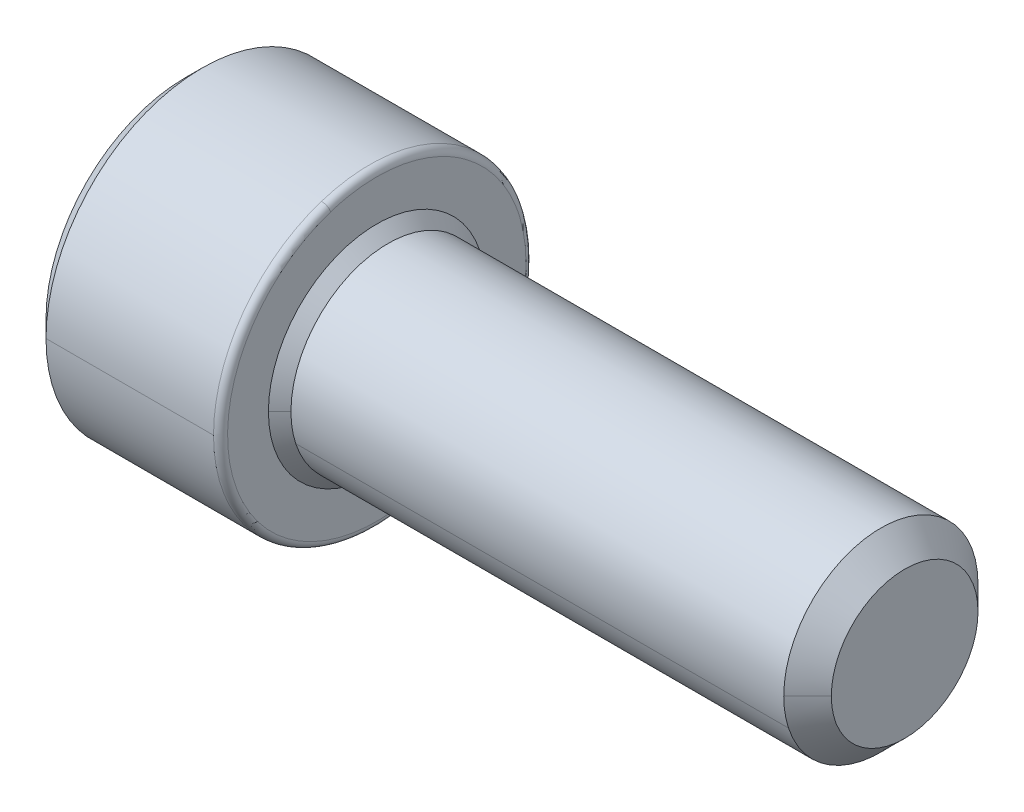
ISO-10303-21;
HEADER;
FILE_DESCRIPTION(('STEP AP214'),'2;1');
FILE_NAME('part.step','',(''),(''),'','','');
FILE_SCHEMA(('AUTOMOTIVE_DESIGN { 1 0 10303 214 1 1 1 1 }'));
ENDSEC;
DATA;
#1=APPLICATION_CONTEXT('core data for automotive mechanical design processes');
#2=APPLICATION_PROTOCOL_DEFINITION('international standard','automotive_design',2000,#1);
#3=PRODUCT_CONTEXT('',#1,'mechanical');
#4=PRODUCT('Part','Part','',(#3));
#5=PRODUCT_RELATED_PRODUCT_CATEGORY('part','',(#4));
#6=PRODUCT_DEFINITION_FORMATION('','',#4);
#7=PRODUCT_DEFINITION_CONTEXT('part definition',#1,'design');
#8=PRODUCT_DEFINITION('design','',#6,#7);
#9=PRODUCT_DEFINITION_SHAPE('','',#8);
#10=(LENGTH_UNIT() NAMED_UNIT(*) SI_UNIT(.MILLI.,.METRE.));
#11=(NAMED_UNIT(*) PLANE_ANGLE_UNIT() SI_UNIT($,.RADIAN.));
#12=(NAMED_UNIT(*) SI_UNIT($,.STERADIAN.) SOLID_ANGLE_UNIT());
#13=UNCERTAINTY_MEASURE_WITH_UNIT(LENGTH_MEASURE(1.E-05),#10,'distance_accuracy_value','');
#14=(GEOMETRIC_REPRESENTATION_CONTEXT(3) GLOBAL_UNCERTAINTY_ASSIGNED_CONTEXT((#13)) GLOBAL_UNIT_ASSIGNED_CONTEXT((#10,
#11,#12)) REPRESENTATION_CONTEXT('',''));
#15=CARTESIAN_POINT('',(0.,0.,0.));
#16=DIRECTION('',(0.,0.,1.));
#17=DIRECTION('',(1.,0.,0.));
#18=AXIS2_PLACEMENT_3D('',#15,#16,#17);
#19=CARTESIAN_POINT('',(-3.4544,1.400175,0.));
#20=DIRECTION('',(1.,0.,0.));
#21=DIRECTION('',(0.,0.,-1.));
#22=AXIS2_PLACEMENT_3D('',#19,#20,#21);
#23=PLANE('',#22);
#24=CARTESIAN_POINT('',(-3.4544,0.,0.));
#25=DIRECTION('',(1.,0.,0.));
#26=DIRECTION('',(0.,0.,-1.));
#27=AXIS2_PLACEMENT_3D('',#24,#25,#26);
#28=CIRCLE('',#27,2.5146);
#29=CARTESIAN_POINT('',(-3.4544,0.,2.5146));
#30=VERTEX_POINT('',#29);
#31=CARTESIAN_POINT('',(-3.4544,0.,-2.5146));
#32=VERTEX_POINT('',#31);
#33=EDGE_CURVE('E11',#30,#32,#28,.T.);
#34=ORIENTED_EDGE('',*,*,#33,.F.);
#35=CARTESIAN_POINT('',(-3.4544,0.,0.));
#36=DIRECTION('',(1.,0.,0.));
#37=DIRECTION('',(0.,0.,-1.));
#38=AXIS2_PLACEMENT_3D('',#35,#36,#37);
#39=CIRCLE('',#38,2.5146);
#40=EDGE_CURVE('E25',#32,#30,#39,.T.);
#41=ORIENTED_EDGE('',*,*,#40,.F.);
#42=EDGE_LOOP('',(#34,#41));
#43=FACE_BOUND('',#42,.T.);
#44=DIRECTION('',(0.,-0.500000000000017,0.866025403784429));
#45=VECTOR('',#44,1.);
#46=CARTESIAN_POINT('',(-3.4544,-0.86254336974385,-1.30638105987198));
#47=LINE('',#46,#45);
#48=CARTESIAN_POINT('',(-3.4544,-0.80839141316258,-1.400175));
#49=VERTEX_POINT('',#48);
#50=CARTESIAN_POINT('',(-3.4544,-1.6167828263252,0.));
#51=VERTEX_POINT('',#50);
#52=EDGE_CURVE('E535',#49,#51,#47,.T.);
#53=ORIENTED_EDGE('',*,*,#52,.F.);
#54=DIRECTION('',(0.,-1.,0.));
#55=VECTOR('',#54,1.);
#56=CARTESIAN_POINT('',(-3.4544,1.400175,-1.400175));
#57=LINE('',#56,#55);
#58=CARTESIAN_POINT('',(-3.4544,0.80839141316258,-1.400175));
#59=VERTEX_POINT('',#58);
#60=EDGE_CURVE('E530',#59,#49,#57,.T.);
#61=ORIENTED_EDGE('',*,*,#60,.F.);
#62=DIRECTION('',(0.,-0.500000000000017,-0.866025403784429));
#63=VECTOR('',#62,1.);
#64=CARTESIAN_POINT('',(-3.4544,1.56263086974389,-0.0937939401280775));
#65=LINE('',#64,#63);
#66=CARTESIAN_POINT('',(-3.4544,1.6167828263252,0.));
#67=VERTEX_POINT('',#66);
#68=EDGE_CURVE('E525',#67,#59,#65,.T.);
#69=ORIENTED_EDGE('',*,*,#68,.F.);
#70=DIRECTION('',(0.,0.500000000000017,-0.866025403784429));
#71=VECTOR('',#70,1.);
#72=CARTESIAN_POINT('',(-3.4544,1.56263086974389,0.0937939401280775));
#73=LINE('',#72,#71);
#74=CARTESIAN_POINT('',(-3.4544,0.80839141316258,1.400175));
#75=VERTEX_POINT('',#74);
#76=EDGE_CURVE('E520',#75,#67,#73,.T.);
#77=ORIENTED_EDGE('',*,*,#76,.F.);
#78=DIRECTION('',(0.,1.,0.));
#79=VECTOR('',#78,1.);
#80=CARTESIAN_POINT('',(-3.4544,1.400175,1.400175));
#81=LINE('',#80,#79);
#82=CARTESIAN_POINT('',(-3.4544,-0.80839141316258,1.400175));
#83=VERTEX_POINT('',#82);
#84=EDGE_CURVE('E515',#83,#75,#81,.T.);
#85=ORIENTED_EDGE('',*,*,#84,.F.);
#86=DIRECTION('',(0.,0.500000000000017,0.866025403784429));
#87=VECTOR('',#86,1.);
#88=CARTESIAN_POINT('',(-3.4544,-0.86254336974385,1.30638105987198));
#89=LINE('',#88,#87);
#90=EDGE_CURVE('E510',#51,#83,#89,.T.);
#91=ORIENTED_EDGE('',*,*,#90,.F.);
#92=EDGE_LOOP('',(#53,#61,#69,#77,#85,#91));
#93=FACE_BOUND('',#92,.T.);
#94=ADVANCED_FACE('F17',(#43,#93),#23,.F.);
#95=CARTESIAN_POINT('',(-1.8288,-0.80839141316258,1.400175));
#96=DIRECTION('',(0.,0.866025403784429,-0.500000000000017));
#97=DIRECTION('',(0.,0.500000000000017,0.866025403784429));
#98=AXIS2_PLACEMENT_3D('',#95,#96,#97);
#99=PLANE('',#98);
#100=DIRECTION('',(0.,-0.500000000000017,-0.866025403784429));
#101=VECTOR('',#100,1.);
#102=CARTESIAN_POINT('',(-1.8288,-0.80839141316258,1.400175));
#103=LINE('',#102,#101);
#104=CARTESIAN_POINT('',(-1.8288,-0.80839141316258,1.400175));
#105=VERTEX_POINT('',#104);
#106=CARTESIAN_POINT('',(-1.8288,-1.21258711974387,0.700087500000029));
#107=VERTEX_POINT('',#106);
#108=EDGE_CURVE('E506',#105,#107,#103,.T.);
#109=ORIENTED_EDGE('',*,*,#108,.T.);
#110=DIRECTION('',(0.,-0.500000000000017,-0.866025403784429));
#111=VECTOR('',#110,1.);
#112=CARTESIAN_POINT('',(-1.8288,-0.80839141316258,1.400175));
#113=LINE('',#112,#111);
#114=CARTESIAN_POINT('',(-1.8288,-1.6167828263252,0.));
#115=VERTEX_POINT('',#114);
#116=EDGE_CURVE('E502',#107,#115,#113,.T.);
#117=ORIENTED_EDGE('',*,*,#116,.T.);
#118=DIRECTION('',(-1.,0.,0.));
#119=VECTOR('',#118,1.);
#120=CARTESIAN_POINT('',(-1.8288,-1.6167828263252,0.));
#121=LINE('',#120,#119);
#122=EDGE_CURVE('E497',#115,#51,#121,.T.);
#123=ORIENTED_EDGE('',*,*,#122,.T.);
#124=ORIENTED_EDGE('',*,*,#90,.T.);
#125=DIRECTION('',(-1.,0.,0.));
#126=VECTOR('',#125,1.);
#127=CARTESIAN_POINT('',(-1.8288,-0.80839141316258,1.400175));
#128=LINE('',#127,#126);
#129=EDGE_CURVE('E492',#105,#83,#128,.T.);
#130=ORIENTED_EDGE('',*,*,#129,.F.);
#131=EDGE_LOOP('',(#109,#117,#123,#124,#130));
#132=FACE_BOUND('',#131,.T.);
#133=ADVANCED_FACE('F587',(#132),#99,.T.);
#134=CARTESIAN_POINT('',(-1.8288,0.80839141316258,1.400175));
#135=DIRECTION('',(0.,0.,-1.));
#136=DIRECTION('',(-1.,0.,0.));
#137=AXIS2_PLACEMENT_3D('',#134,#135,#136);
#138=PLANE('',#137);
#139=DIRECTION('',(0.,-1.,0.));
#140=VECTOR('',#139,1.);
#141=CARTESIAN_POINT('',(-1.8288,0.80839141316258,1.400175));
#142=LINE('',#141,#140);
#143=CARTESIAN_POINT('',(-1.8288,0.80839141316258,1.400175));
#144=VERTEX_POINT('',#143);
#145=CARTESIAN_POINT('',(-1.8288,0.,1.400175));
#146=VERTEX_POINT('',#145);
#147=EDGE_CURVE('E488',#144,#146,#142,.T.);
#148=ORIENTED_EDGE('',*,*,#147,.T.);
#149=DIRECTION('',(0.,-1.,0.));
#150=VECTOR('',#149,1.);
#151=CARTESIAN_POINT('',(-1.8288,0.80839141316258,1.400175));
#152=LINE('',#151,#150);
#153=EDGE_CURVE('E483',#146,#105,#152,.T.);
#154=ORIENTED_EDGE('',*,*,#153,.T.);
#155=ORIENTED_EDGE('',*,*,#129,.T.);
#156=ORIENTED_EDGE('',*,*,#84,.T.);
#157=DIRECTION('',(-1.,0.,0.));
#158=VECTOR('',#157,1.);
#159=CARTESIAN_POINT('',(-1.8288,0.80839141316258,1.400175));
#160=LINE('',#159,#158);
#161=EDGE_CURVE('E478',#144,#75,#160,.T.);
#162=ORIENTED_EDGE('',*,*,#161,.F.);
#163=EDGE_LOOP('',(#148,#154,#155,#156,#162));
#164=FACE_BOUND('',#163,.T.);
#165=ADVANCED_FACE('F591',(#164),#138,.T.);
#166=CARTESIAN_POINT('',(-1.8288,1.6167828263252,0.));
#167=DIRECTION('',(0.,-0.866025403784429,-0.500000000000017));
#168=DIRECTION('',(0.,0.500000000000017,-0.866025403784429));
#169=AXIS2_PLACEMENT_3D('',#166,#167,#168);
#170=PLANE('',#169);
#171=DIRECTION('',(0.,-0.500000000000017,0.866025403784429));
#172=VECTOR('',#171,1.);
#173=CARTESIAN_POINT('',(-1.8288,1.6167828263252,0.));
#174=LINE('',#173,#172);
#175=CARTESIAN_POINT('',(-1.8288,1.6167828263252,0.));
#176=VERTEX_POINT('',#175);
#177=CARTESIAN_POINT('',(-1.8288,1.21258711974387,0.700087500000029));
#178=VERTEX_POINT('',#177);
#179=EDGE_CURVE('E474',#176,#178,#174,.T.);
#180=ORIENTED_EDGE('',*,*,#179,.T.);
#181=DIRECTION('',(0.,-0.500000000000017,0.866025403784429));
#182=VECTOR('',#181,1.);
#183=CARTESIAN_POINT('',(-1.8288,1.6167828263252,0.));
#184=LINE('',#183,#182);
#185=EDGE_CURVE('E469',#178,#144,#184,.T.);
#186=ORIENTED_EDGE('',*,*,#185,.T.);
#187=ORIENTED_EDGE('',*,*,#161,.T.);
#188=ORIENTED_EDGE('',*,*,#76,.T.);
#189=DIRECTION('',(-1.,0.,0.));
#190=VECTOR('',#189,1.);
#191=CARTESIAN_POINT('',(-1.8288,1.6167828263252,0.));
#192=LINE('',#191,#190);
#193=EDGE_CURVE('E464',#176,#67,#192,.T.);
#194=ORIENTED_EDGE('',*,*,#193,.F.);
#195=EDGE_LOOP('',(#180,#186,#187,#188,#194));
#196=FACE_BOUND('',#195,.T.);
#197=ADVANCED_FACE('F606',(#196),#170,.T.);
#198=CARTESIAN_POINT('',(-1.8288,0.80839141316258,-1.400175));
#199=DIRECTION('',(0.,-0.866025403784429,0.500000000000017));
#200=DIRECTION('',(0.,-0.500000000000017,-0.866025403784429));
#201=AXIS2_PLACEMENT_3D('',#198,#199,#200);
#202=PLANE('',#201);
#203=DIRECTION('',(0.,0.500000000000017,0.866025403784429));
#204=VECTOR('',#203,1.);
#205=CARTESIAN_POINT('',(-1.8288,0.80839141316258,-1.400175));
#206=LINE('',#205,#204);
#207=CARTESIAN_POINT('',(-1.8288,0.80839141316258,-1.400175));
#208=VERTEX_POINT('',#207);
#209=CARTESIAN_POINT('',(-1.8288,1.21258711974387,-0.700087500000029));
#210=VERTEX_POINT('',#209);
#211=EDGE_CURVE('E460',#208,#210,#206,.T.);
#212=ORIENTED_EDGE('',*,*,#211,.T.);
#213=DIRECTION('',(0.,0.500000000000017,0.866025403784429));
#214=VECTOR('',#213,1.);
#215=CARTESIAN_POINT('',(-1.8288,0.80839141316258,-1.400175));
#216=LINE('',#215,#214);
#217=EDGE_CURVE('E455',#210,#176,#216,.T.);
#218=ORIENTED_EDGE('',*,*,#217,.T.);
#219=ORIENTED_EDGE('',*,*,#193,.T.);
#220=ORIENTED_EDGE('',*,*,#68,.T.);
#221=DIRECTION('',(-1.,0.,0.));
#222=VECTOR('',#221,1.);
#223=CARTESIAN_POINT('',(-1.8288,0.80839141316258,-1.400175));
#224=LINE('',#223,#222);
#225=EDGE_CURVE('E450',#208,#59,#224,.T.);
#226=ORIENTED_EDGE('',*,*,#225,.F.);
#227=EDGE_LOOP('',(#212,#218,#219,#220,#226));
#228=FACE_BOUND('',#227,.T.);
#229=ADVANCED_FACE('F604',(#228),#202,.T.);
#230=CARTESIAN_POINT('',(-1.8288,-0.80839141316258,-1.400175));
#231=DIRECTION('',(0.,0.,1.));
#232=DIRECTION('',(1.,0.,0.));
#233=AXIS2_PLACEMENT_3D('',#230,#231,#232);
#234=PLANE('',#233);
#235=DIRECTION('',(0.,1.,0.));
#236=VECTOR('',#235,1.);
#237=CARTESIAN_POINT('',(-1.8288,-0.80839141316258,-1.400175));
#238=LINE('',#237,#236);
#239=CARTESIAN_POINT('',(-1.8288,-0.80839141316258,-1.400175));
#240=VERTEX_POINT('',#239);
#241=CARTESIAN_POINT('',(-1.8288,0.,-1.400175));
#242=VERTEX_POINT('',#241);
#243=EDGE_CURVE('E446',#240,#242,#238,.T.);
#244=ORIENTED_EDGE('',*,*,#243,.T.);
#245=DIRECTION('',(0.,1.,0.));
#246=VECTOR('',#245,1.);
#247=CARTESIAN_POINT('',(-1.8288,-0.80839141316258,-1.400175));
#248=LINE('',#247,#246);
#249=EDGE_CURVE('E441',#242,#208,#248,.T.);
#250=ORIENTED_EDGE('',*,*,#249,.T.);
#251=ORIENTED_EDGE('',*,*,#225,.T.);
#252=ORIENTED_EDGE('',*,*,#60,.T.);
#253=DIRECTION('',(-1.,0.,0.));
#254=VECTOR('',#253,1.);
#255=CARTESIAN_POINT('',(-1.8288,-0.80839141316258,-1.400175));
#256=LINE('',#255,#254);
#257=EDGE_CURVE('E436',#240,#49,#256,.T.);
#258=ORIENTED_EDGE('',*,*,#257,.F.);
#259=EDGE_LOOP('',(#244,#250,#251,#252,#258));
#260=FACE_BOUND('',#259,.T.);
#261=ADVANCED_FACE('F600',(#260),#234,.T.);
#262=CARTESIAN_POINT('',(-1.8288,-1.6167828263252,0.));
#263=DIRECTION('',(0.,0.866025403784429,0.500000000000017));
#264=DIRECTION('',(0.,-0.500000000000017,0.866025403784429));
#265=AXIS2_PLACEMENT_3D('',#262,#263,#264);
#266=PLANE('',#265);
#267=DIRECTION('',(0.,0.500000000000017,-0.866025403784429));
#268=VECTOR('',#267,1.);
#269=CARTESIAN_POINT('',(-1.8288,-1.6167828263252,0.));
#270=LINE('',#269,#268);
#271=CARTESIAN_POINT('',(-1.8288,-1.21258711974387,-0.700087500000029));
#272=VERTEX_POINT('',#271);
#273=EDGE_CURVE('E432',#115,#272,#270,.T.);
#274=ORIENTED_EDGE('',*,*,#273,.T.);
#275=DIRECTION('',(0.,0.500000000000017,-0.866025403784429));
#276=VECTOR('',#275,1.);
#277=CARTESIAN_POINT('',(-1.8288,-1.6167828263252,0.));
#278=LINE('',#277,#276);
#279=EDGE_CURVE('E427',#272,#240,#278,.T.);
#280=ORIENTED_EDGE('',*,*,#279,.T.);
#281=ORIENTED_EDGE('',*,*,#257,.T.);
#282=ORIENTED_EDGE('',*,*,#52,.T.);
#283=ORIENTED_EDGE('',*,*,#122,.F.);
#284=EDGE_LOOP('',(#274,#280,#281,#282,#283));
#285=FACE_BOUND('',#284,.T.);
#286=ADVANCED_FACE('F596',(#285),#266,.T.);
#287=CARTESIAN_POINT('',(-1.8288,0.,0.));
#288=DIRECTION('',(1.,0.,0.));
#289=DIRECTION('',(0.,0.,-1.));
#290=AXIS2_PLACEMENT_3D('',#287,#288,#289);
#291=PLANE('',#290);
#292=ORIENTED_EDGE('',*,*,#243,.F.);
#293=ORIENTED_EDGE('',*,*,#279,.F.);
#294=CARTESIAN_POINT('',(-1.8288,0.,0.));
#295=DIRECTION('',(1.,0.,0.));
#296=DIRECTION('',(0.,0.,-1.));
#297=AXIS2_PLACEMENT_3D('',#294,#295,#296);
#298=CIRCLE('',#297,1.400175);
#299=EDGE_CURVE('E422',#272,#242,#298,.T.);
#300=ORIENTED_EDGE('',*,*,#299,.T.);
#301=EDGE_LOOP('',(#292,#293,#300));
#302=FACE_BOUND('',#301,.T.);
#303=ADVANCED_FACE('F386',(#302),#291,.F.);
#304=CARTESIAN_POINT('',(-1.4246042934187,0.,0.));
#305=DIRECTION('',(-1.,0.,0.));
#306=DIRECTION('',(0.,1.,0.));
#307=AXIS2_PLACEMENT_3D('',#304,#305,#306);
#308=CONICAL_SURFACE('',#307,0.7000875,1.04719755119659);
#309=DIRECTION('',(-0.500000000000007,0.,-0.866025403784435));
#310=VECTOR('',#309,1.);
#311=CARTESIAN_POINT('',(-1.4246042934187,0.,-0.7000875));
#312=LINE('',#311,#310);
#313=CARTESIAN_POINT('',(-1.4246042934187,0.,-0.7000875));
#314=VERTEX_POINT('',#313);
#315=EDGE_CURVE('E417',#314,#242,#312,.T.);
#316=ORIENTED_EDGE('',*,*,#315,.T.);
#317=ORIENTED_EDGE('',*,*,#299,.F.);
#318=CARTESIAN_POINT('',(-1.8288,0.,0.));
#319=DIRECTION('',(1.,0.,0.));
#320=DIRECTION('',(0.,0.,-1.));
#321=AXIS2_PLACEMENT_3D('',#318,#319,#320);
#322=CIRCLE('',#321,1.400175);
#323=EDGE_CURVE('E412',#107,#272,#322,.T.);
#324=ORIENTED_EDGE('',*,*,#323,.F.);
#325=CARTESIAN_POINT('',(-1.8288,0.,0.));
#326=DIRECTION('',(1.,0.,0.));
#327=DIRECTION('',(0.,0.,-1.));
#328=AXIS2_PLACEMENT_3D('',#325,#326,#327);
#329=CIRCLE('',#328,1.400175);
#330=EDGE_CURVE('E407',#146,#107,#329,.T.);
#331=ORIENTED_EDGE('',*,*,#330,.F.);
#332=DIRECTION('',(-0.500000000000007,0.,0.866025403784435));
#333=VECTOR('',#332,1.);
#334=CARTESIAN_POINT('',(-1.4246042934187,0.,0.7000875));
#335=LINE('',#334,#333);
#336=CARTESIAN_POINT('',(-1.4246042934187,0.,0.7000875));
#337=VERTEX_POINT('',#336);
#338=EDGE_CURVE('E404',#337,#146,#335,.T.);
#339=ORIENTED_EDGE('',*,*,#338,.F.);
#340=CARTESIAN_POINT('',(-1.4246042934187,0.,0.));
#341=DIRECTION('',(1.,0.,0.));
#342=DIRECTION('',(0.,0.,1.));
#343=AXIS2_PLACEMENT_3D('',#340,#341,#342);
#344=CIRCLE('',#343,0.7000875);
#345=CARTESIAN_POINT('',(-1.42460429341869,-0.700087500000019,0.));
#346=VERTEX_POINT('',#345);
#347=EDGE_CURVE('E402',#337,#346,#344,.T.);
#348=ORIENTED_EDGE('',*,*,#347,.T.);
#349=CARTESIAN_POINT('',(-1.4246042934187,0.,0.));
#350=DIRECTION('',(1.,0.,0.));
#351=DIRECTION('',(0.,0.,-1.));
#352=AXIS2_PLACEMENT_3D('',#349,#350,#351);
#353=CIRCLE('',#352,0.7000875);
#354=EDGE_CURVE('E658',#346,#314,#353,.T.);
#355=ORIENTED_EDGE('',*,*,#354,.T.);
#356=EDGE_LOOP('',(#316,#317,#324,#331,#339,#348,#355));
#357=FACE_BOUND('',#356,.T.);
#358=ADVANCED_FACE('F381',(#357),#308,.F.);
#359=CARTESIAN_POINT('',(-2.63719141316281,0.,0.));
#360=DIRECTION('',(1.,0.,0.));
#361=DIRECTION('',(0.,0.,1.));
#362=AXIS2_PLACEMENT_3D('',#359,#360,#361);
#363=SPHERICAL_SURFACE('',#362,1.40017500000021);
#364=CARTESIAN_POINT('',(-2.63719141316281,0.,0.));
#365=DIRECTION('',(0.,0.,1.));
#366=DIRECTION('',(1.,0.,0.));
#367=AXIS2_PLACEMENT_3D('',#364,#365,#366);
#368=CIRCLE('',#367,1.40017500000021);
#369=CARTESIAN_POINT('',(-1.2370164131626,0.,0.));
#370=VERTEX_POINT('',#369);
#371=CARTESIAN_POINT('',(-1.42460429341869,0.700087499999988,0.));
#372=VERTEX_POINT('',#371);
#373=EDGE_CURVE('E659',#370,#372,#368,.T.);
#374=ORIENTED_EDGE('',*,*,#373,.T.);
#375=CARTESIAN_POINT('',(-1.4246042934187,0.,0.));
#376=DIRECTION('',(1.,0.,0.));
#377=DIRECTION('',(0.,0.,-1.));
#378=AXIS2_PLACEMENT_3D('',#375,#376,#377);
#379=CIRCLE('',#378,0.7000875);
#380=EDGE_CURVE('E655',#314,#372,#379,.T.);
#381=ORIENTED_EDGE('',*,*,#380,.F.);
#382=ORIENTED_EDGE('',*,*,#354,.F.);
#383=CARTESIAN_POINT('',(-2.63719141316281,0.,0.));
#384=DIRECTION('',(0.,0.,-1.));
#385=DIRECTION('',(1.,0.,0.));
#386=AXIS2_PLACEMENT_3D('',#383,#384,#385);
#387=CIRCLE('',#386,1.40017500000021);
#388=EDGE_CURVE('E356',#370,#346,#387,.T.);
#389=ORIENTED_EDGE('',*,*,#388,.F.);
#390=EDGE_LOOP('',(#374,#381,#382,#389));
#391=FACE_BOUND('',#390,.T.);
#392=ADVANCED_FACE('F376',(#391),#363,.F.);
#393=CARTESIAN_POINT('',(-2.63719141316281,0.,0.));
#394=DIRECTION('',(1.,0.,0.));
#395=DIRECTION('',(0.,0.,-1.));
#396=AXIS2_PLACEMENT_3D('',#393,#394,#395);
#397=SPHERICAL_SURFACE('',#396,1.40017500000021);
#398=ORIENTED_EDGE('',*,*,#388,.T.);
#399=ORIENTED_EDGE('',*,*,#347,.F.);
#400=CARTESIAN_POINT('',(-1.4246042934187,0.,0.));
#401=DIRECTION('',(1.,0.,0.));
#402=DIRECTION('',(0.,0.,-1.));
#403=AXIS2_PLACEMENT_3D('',#400,#401,#402);
#404=CIRCLE('',#403,0.7000875);
#405=EDGE_CURVE('E351',#372,#337,#404,.T.);
#406=ORIENTED_EDGE('',*,*,#405,.F.);
#407=ORIENTED_EDGE('',*,*,#373,.F.);
#408=EDGE_LOOP('',(#398,#399,#406,#407));
#409=FACE_BOUND('',#408,.T.);
#410=ADVANCED_FACE('F365',(#409),#397,.F.);
#411=CARTESIAN_POINT('',(-1.4246042934187,0.,0.));
#412=DIRECTION('',(-1.,0.,0.));
#413=DIRECTION('',(0.,-1.,0.));
#414=AXIS2_PLACEMENT_3D('',#411,#412,#413);
#415=CONICAL_SURFACE('',#414,0.7000875,1.04719755119659);
#416=ORIENTED_EDGE('',*,*,#315,.F.);
#417=ORIENTED_EDGE('',*,*,#380,.T.);
#418=ORIENTED_EDGE('',*,*,#405,.T.);
#419=ORIENTED_EDGE('',*,*,#338,.T.);
#420=CARTESIAN_POINT('',(-1.8288,0.,0.));
#421=DIRECTION('',(1.,0.,0.));
#422=DIRECTION('',(0.,0.,-1.));
#423=AXIS2_PLACEMENT_3D('',#420,#421,#422);
#424=CIRCLE('',#423,1.400175);
#425=EDGE_CURVE('E346',#178,#146,#424,.T.);
#426=ORIENTED_EDGE('',*,*,#425,.F.);
#427=CARTESIAN_POINT('',(-1.8288,0.,0.));
#428=DIRECTION('',(1.,0.,0.));
#429=DIRECTION('',(0.,0.,-1.));
#430=AXIS2_PLACEMENT_3D('',#427,#428,#429);
#431=CIRCLE('',#430,1.400175);
#432=EDGE_CURVE('E341',#210,#178,#431,.T.);
#433=ORIENTED_EDGE('',*,*,#432,.F.);
#434=CARTESIAN_POINT('',(-1.8288,0.,0.));
#435=DIRECTION('',(1.,0.,0.));
#436=DIRECTION('',(0.,0.,-1.));
#437=AXIS2_PLACEMENT_3D('',#434,#435,#436);
#438=CIRCLE('',#437,1.400175);
#439=EDGE_CURVE('E336',#242,#210,#438,.T.);
#440=ORIENTED_EDGE('',*,*,#439,.F.);
#441=EDGE_LOOP('',(#416,#417,#418,#419,#426,#433,#440));
#442=FACE_BOUND('',#441,.T.);
#443=ADVANCED_FACE('F375',(#442),#415,.F.);
#444=CARTESIAN_POINT('',(-1.8288,0.,0.));
#445=DIRECTION('',(1.,0.,0.));
#446=DIRECTION('',(0.,0.,-1.));
#447=AXIS2_PLACEMENT_3D('',#444,#445,#446);
#448=PLANE('',#447);
#449=ORIENTED_EDGE('',*,*,#211,.F.);
#450=ORIENTED_EDGE('',*,*,#249,.F.);
#451=ORIENTED_EDGE('',*,*,#439,.T.);
#452=EDGE_LOOP('',(#449,#450,#451));
#453=FACE_BOUND('',#452,.T.);
#454=ADVANCED_FACE('F640',(#453),#448,.F.);
#455=CARTESIAN_POINT('',(-1.8288,0.,0.));
#456=DIRECTION('',(1.,0.,0.));
#457=DIRECTION('',(0.,0.,-1.));
#458=AXIS2_PLACEMENT_3D('',#455,#456,#457);
#459=PLANE('',#458);
#460=ORIENTED_EDGE('',*,*,#179,.F.);
#461=ORIENTED_EDGE('',*,*,#217,.F.);
#462=ORIENTED_EDGE('',*,*,#432,.T.);
#463=EDGE_LOOP('',(#460,#461,#462));
#464=FACE_BOUND('',#463,.T.);
#465=ADVANCED_FACE('F637',(#464),#459,.F.);
#466=CARTESIAN_POINT('',(-1.8288,0.,0.));
#467=DIRECTION('',(1.,0.,0.));
#468=DIRECTION('',(0.,0.,-1.));
#469=AXIS2_PLACEMENT_3D('',#466,#467,#468);
#470=PLANE('',#469);
#471=ORIENTED_EDGE('',*,*,#147,.F.);
#472=ORIENTED_EDGE('',*,*,#185,.F.);
#473=ORIENTED_EDGE('',*,*,#425,.T.);
#474=EDGE_LOOP('',(#471,#472,#473));
#475=FACE_BOUND('',#474,.T.);
#476=ADVANCED_FACE('F630',(#475),#470,.F.);
#477=CARTESIAN_POINT('',(-1.8288,0.,0.));
#478=DIRECTION('',(1.,0.,0.));
#479=DIRECTION('',(0.,0.,-1.));
#480=AXIS2_PLACEMENT_3D('',#477,#478,#479);
#481=PLANE('',#480);
#482=ORIENTED_EDGE('',*,*,#108,.F.);
#483=ORIENTED_EDGE('',*,*,#153,.F.);
#484=ORIENTED_EDGE('',*,*,#330,.T.);
#485=EDGE_LOOP('',(#482,#483,#484));
#486=FACE_BOUND('',#485,.T.);
#487=ADVANCED_FACE('F623',(#486),#481,.F.);
#488=CARTESIAN_POINT('',(-1.8288,0.,0.));
#489=DIRECTION('',(1.,0.,0.));
#490=DIRECTION('',(0.,0.,-1.));
#491=AXIS2_PLACEMENT_3D('',#488,#489,#490);
#492=PLANE('',#491);
#493=ORIENTED_EDGE('',*,*,#273,.F.);
#494=ORIENTED_EDGE('',*,*,#116,.F.);
#495=ORIENTED_EDGE('',*,*,#323,.T.);
#496=EDGE_LOOP('',(#493,#494,#495));
#497=FACE_BOUND('',#496,.T.);
#498=ADVANCED_FACE('F621',(#497),#492,.F.);
#499=CARTESIAN_POINT('',(-3.4544,0.,0.));
#500=DIRECTION('',(1.,0.,0.));
#501=DIRECTION('',(0.,-1.,0.));
#502=AXIS2_PLACEMENT_3D('',#499,#500,#501);
#503=CONICAL_SURFACE('',#502,2.5146,0.78539816339745);
#504=DIRECTION('',(0.707106781186546,0.,0.707106781186549));
#505=VECTOR('',#504,1.);
#506=CARTESIAN_POINT('',(-3.4544,0.,2.5146));
#507=LINE('',#506,#505);
#508=CARTESIAN_POINT('',(-3.1496,0.,2.8194));
#509=VERTEX_POINT('',#508);
#510=EDGE_CURVE('E332',#30,#509,#507,.T.);
#511=ORIENTED_EDGE('',*,*,#510,.T.);
#512=CARTESIAN_POINT('',(-3.1496,0.,0.));
#513=DIRECTION('',(1.,0.,0.));
#514=DIRECTION('',(0.,0.,-1.));
#515=AXIS2_PLACEMENT_3D('',#512,#513,#514);
#516=CIRCLE('',#515,2.8194);
#517=CARTESIAN_POINT('',(-3.1496,0.,-2.8194));
#518=VERTEX_POINT('',#517);
#519=EDGE_CURVE('E327',#518,#509,#516,.T.);
#520=ORIENTED_EDGE('',*,*,#519,.F.);
#521=DIRECTION('',(0.707106781186546,0.,-0.707106781186549));
#522=VECTOR('',#521,1.);
#523=CARTESIAN_POINT('',(-3.4544,0.,-2.5146));
#524=LINE('',#523,#522);
#525=EDGE_CURVE('E322',#32,#518,#524,.T.);
#526=ORIENTED_EDGE('',*,*,#525,.F.);
#527=ORIENTED_EDGE('',*,*,#40,.T.);
#528=EDGE_LOOP('',(#511,#520,#526,#527));
#529=FACE_BOUND('',#528,.T.);
#530=ADVANCED_FACE('F545',(#529),#503,.T.);
#531=CARTESIAN_POINT('',(-3.4544,0.,0.));
#532=DIRECTION('',(1.,0.,0.));
#533=DIRECTION('',(0.,1.,0.));
#534=AXIS2_PLACEMENT_3D('',#531,#532,#533);
#535=CONICAL_SURFACE('',#534,2.5146,0.78539816339745);
#536=ORIENTED_EDGE('',*,*,#510,.F.);
#537=ORIENTED_EDGE('',*,*,#33,.T.);
#538=ORIENTED_EDGE('',*,*,#525,.T.);
#539=CARTESIAN_POINT('',(-3.1496,0.,0.));
#540=DIRECTION('',(1.,0.,0.));
#541=DIRECTION('',(0.,0.,-1.));
#542=AXIS2_PLACEMENT_3D('',#539,#540,#541);
#543=CIRCLE('',#542,2.8194);
#544=EDGE_CURVE('E317',#509,#518,#543,.T.);
#545=ORIENTED_EDGE('',*,*,#544,.F.);
#546=EDGE_LOOP('',(#536,#537,#538,#545));
#547=FACE_BOUND('',#546,.T.);
#548=ADVANCED_FACE('F548',(#547),#535,.T.);
#549=CARTESIAN_POINT('',(9.525,0.,0.));
#550=DIRECTION('',(1.,0.,0.));
#551=DIRECTION('',(0.,1.,0.));
#552=AXIS2_PLACEMENT_3D('',#549,#550,#551);
#553=CYLINDRICAL_SURFACE('',#552,2.8194);
#554=DIRECTION('',(1.,0.,0.));
#555=VECTOR('',#554,1.);
#556=CARTESIAN_POINT('',(-3.1496,0.,2.8194));
#557=LINE('',#556,#555);
#558=CARTESIAN_POINT('',(-0.127000000000001,0.,2.8194));
#559=VERTEX_POINT('',#558);
#560=EDGE_CURVE('E312',#509,#559,#557,.T.);
#561=ORIENTED_EDGE('',*,*,#560,.F.);
#562=ORIENTED_EDGE('',*,*,#544,.T.);
#563=DIRECTION('',(1.,0.,0.));
#564=VECTOR('',#563,1.);
#565=CARTESIAN_POINT('',(-3.1496,0.,-2.8194));
#566=LINE('',#565,#564);
#567=CARTESIAN_POINT('',(-0.127,0.,-2.8194));
#568=VERTEX_POINT('',#567);
#569=EDGE_CURVE('E308',#518,#568,#566,.T.);
#570=ORIENTED_EDGE('',*,*,#569,.T.);
#571=CARTESIAN_POINT('',(-0.127,0.,0.));
#572=DIRECTION('',(1.,0.,0.));
#573=DIRECTION('',(0.,0.,-1.));
#574=AXIS2_PLACEMENT_3D('',#571,#572,#573);
#575=CIRCLE('',#574,2.8194);
#576=CARTESIAN_POINT('',(-0.127,-2.68140874204254,-0.871242513940722));
#577=VERTEX_POINT('',#576);
#578=EDGE_CURVE('E303',#577,#568,#575,.T.);
#579=ORIENTED_EDGE('',*,*,#578,.F.);
#580=CARTESIAN_POINT('',(-0.127,0.,0.));
#581=DIRECTION('',(1.,0.,0.));
#582=DIRECTION('',(0.,0.,-1.));
#583=AXIS2_PLACEMENT_3D('',#580,#581,#582);
#584=CIRCLE('',#583,2.8194);
#585=EDGE_CURVE('E298',#559,#577,#584,.T.);
#586=ORIENTED_EDGE('',*,*,#585,.F.);
#587=EDGE_LOOP('',(#561,#562,#570,#579,#586));
#588=FACE_BOUND('',#587,.T.);
#589=ADVANCED_FACE('F552',(#588),#553,.T.);
#590=CARTESIAN_POINT('',(-0.126999999999985,0.,0.));
#591=DIRECTION('',(1.,0.,0.));
#592=DIRECTION('',(0.,0.309016994374947,-0.951056516295154));
#593=AXIS2_PLACEMENT_3D('',#590,#591,#592);
#594=TOROIDAL_SURFACE('',#593,2.6924,0.126999999999985);
#595=CARTESIAN_POINT('',(-0.126999999999985,-2.56062456447307,-0.831997355655108));
#596=DIRECTION('',(0.,0.309016994374947,-0.951056516295154));
#597=DIRECTION('',(1.,0.,0.));
#598=AXIS2_PLACEMENT_3D('',#595,#596,#597);
#599=CIRCLE('',#598,0.126999999999985);
#600=CARTESIAN_POINT('',(0.,-2.56062456447307,-0.831997355655108));
#601=VERTEX_POINT('',#600);
#602=EDGE_CURVE('E294',#601,#577,#599,.T.);
#603=ORIENTED_EDGE('',*,*,#602,.F.);
#604=CARTESIAN_POINT('',(0.,0.,0.));
#605=DIRECTION('',(1.,0.,0.));
#606=DIRECTION('',(0.,0.,-1.));
#607=AXIS2_PLACEMENT_3D('',#604,#605,#606);
#608=CIRCLE('',#607,2.6924);
#609=CARTESIAN_POINT('',(0.,2.56062456447307,0.831997355655108));
#610=VERTEX_POINT('',#609);
#611=EDGE_CURVE('E289',#610,#601,#608,.T.);
#612=ORIENTED_EDGE('',*,*,#611,.F.);
#613=CARTESIAN_POINT('',(-0.126999999999985,2.56062456447307,0.831997355655108));
#614=DIRECTION('',(0.,-0.309016994374947,0.951056516295154));
#615=DIRECTION('',(1.,0.,0.));
#616=AXIS2_PLACEMENT_3D('',#613,#614,#615);
#617=CIRCLE('',#616,0.126999999999985);
#618=CARTESIAN_POINT('',(-0.127,2.68140874204254,0.871242513940722));
#619=VERTEX_POINT('',#618);
#620=EDGE_CURVE('E285',#610,#619,#617,.T.);
#621=ORIENTED_EDGE('',*,*,#620,.T.);
#622=CARTESIAN_POINT('',(-0.127,0.,0.));
#623=DIRECTION('',(1.,0.,0.));
#624=DIRECTION('',(0.,0.,-1.));
#625=AXIS2_PLACEMENT_3D('',#622,#623,#624);
#626=CIRCLE('',#625,2.8194);
#627=EDGE_CURVE('E280',#619,#559,#626,.T.);
#628=ORIENTED_EDGE('',*,*,#627,.T.);
#629=ORIENTED_EDGE('',*,*,#585,.T.);
#630=EDGE_LOOP('',(#603,#612,#621,#628,#629));
#631=FACE_BOUND('',#630,.T.);
#632=ADVANCED_FACE('F557',(#631),#594,.T.);
#633=CARTESIAN_POINT('',(9.525,0.,0.));
#634=DIRECTION('',(1.,0.,0.));
#635=DIRECTION('',(0.,-1.,0.));
#636=AXIS2_PLACEMENT_3D('',#633,#634,#635);
#637=CYLINDRICAL_SURFACE('',#636,2.8194);
#638=ORIENTED_EDGE('',*,*,#560,.T.);
#639=ORIENTED_EDGE('',*,*,#627,.F.);
#640=CARTESIAN_POINT('',(-0.127,0.,0.));
#641=DIRECTION('',(1.,0.,0.));
#642=DIRECTION('',(0.,0.,-1.));
#643=AXIS2_PLACEMENT_3D('',#640,#641,#642);
#644=CIRCLE('',#643,2.8194);
#645=EDGE_CURVE('E277',#568,#619,#644,.T.);
#646=ORIENTED_EDGE('',*,*,#645,.F.);
#647=ORIENTED_EDGE('',*,*,#569,.F.);
#648=ORIENTED_EDGE('',*,*,#519,.T.);
#649=EDGE_LOOP('',(#638,#639,#646,#647,#648));
#650=FACE_BOUND('',#649,.T.);
#651=ADVANCED_FACE('F257',(#650),#637,.T.);
#652=CARTESIAN_POINT('',(-0.126999999999985,0.,0.));
#653=DIRECTION('',(1.,0.,0.));
#654=DIRECTION('',(0.,-0.309016994374947,0.951056516295154));
#655=AXIS2_PLACEMENT_3D('',#652,#653,#654);
#656=TOROIDAL_SURFACE('',#655,2.6924,0.126999999999985);
#657=ORIENTED_EDGE('',*,*,#602,.T.);
#658=ORIENTED_EDGE('',*,*,#578,.T.);
#659=ORIENTED_EDGE('',*,*,#645,.T.);
#660=ORIENTED_EDGE('',*,*,#620,.F.);
#661=CARTESIAN_POINT('',(0.,-2.56062456447307,-0.831997355655108));
#662=CARTESIAN_POINT('',(0.,-2.29899989162133,-1.63608356483975));
#663=CARTESIAN_POINT('',(0.,-1.72302166308733,-2.33972934258677));
#664=CARTESIAN_POINT('',(0.,-0.879623768086056,-2.7683677319083));
#665=CARTESIAN_POINT('',(0.,0.934388443965345,-2.87575193131893));
#666=CARTESIAN_POINT('',(0.,2.3388363027758,-1.72262666334612));
#667=CARTESIAN_POINT('',(0.,2.76921220904233,-0.880114077447228));
#668=CARTESIAN_POINT('',(0.,2.82159577331872,0.0276988231441042));
#669=CARTESIAN_POINT('',(0.,2.56062456447307,0.831997355655107));
#670=B_SPLINE_CURVE_WITH_KNOTS('',5,(#661,#662,#663,#664,#665,#666,#667,#668,#669),
.UNSPECIFIED.,.F.,.F.,(6,3,6),(0.,1.5707963267949,3.14159265358979),.UNSPECIFIED.);
#671=EDGE_CURVE('E276',#601,#610,#670,.T.);
#672=ORIENTED_EDGE('',*,*,#671,.F.);
#673=EDGE_LOOP('',(#657,#658,#659,#660,#672));
#674=FACE_BOUND('',#673,.T.);
#675=ADVANCED_FACE('F251',(#674),#656,.T.);
#676=CARTESIAN_POINT('',(0.,2.6924,0.));
#677=DIRECTION('',(-1.,0.,0.));
#678=DIRECTION('',(0.,0.,1.));
#679=AXIS2_PLACEMENT_3D('',#676,#677,#678);
#680=PLANE('',#679);
#681=CARTESIAN_POINT('',(0.,0.,0.));
#682=DIRECTION('',(1.,0.,0.));
#683=DIRECTION('',(0.,0.,-1.));
#684=AXIS2_PLACEMENT_3D('',#681,#682,#683);
#685=CIRCLE('',#684,1.9558);
#686=CARTESIAN_POINT('',(0.,0.,1.9558));
#687=VERTEX_POINT('',#686);
#688=CARTESIAN_POINT('',(0.,0.,-1.9558));
#689=VERTEX_POINT('',#688);
#690=EDGE_CURVE('E559',#687,#689,#685,.T.);
#691=ORIENTED_EDGE('',*,*,#690,.F.);
#692=CARTESIAN_POINT('',(0.,0.,0.));
#693=DIRECTION('',(1.,0.,0.));
#694=DIRECTION('',(0.,0.,-1.));
#695=AXIS2_PLACEMENT_3D('',#692,#693,#694);
#696=CIRCLE('',#695,1.9558);
#697=EDGE_CURVE('E231',#689,#687,#696,.T.);
#698=ORIENTED_EDGE('',*,*,#697,.F.);
#699=EDGE_LOOP('',(#691,#698));
#700=FACE_BOUND('',#699,.T.);
#701=ORIENTED_EDGE('',*,*,#671,.T.);
#702=ORIENTED_EDGE('',*,*,#611,.T.);
#703=EDGE_LOOP('',(#701,#702));
#704=FACE_BOUND('',#703,.T.);
#705=ADVANCED_FACE('F240',(#700,#704),#680,.F.);
#706=CARTESIAN_POINT('',(0.,0.,0.));
#707=DIRECTION('',(-1.,0.,0.));
#708=DIRECTION('',(0.,-1.,0.));
#709=AXIS2_PLACEMENT_3D('',#706,#707,#708);
#710=CONICAL_SURFACE('',#709,1.9558,0.785398163397448);
#711=DIRECTION('',(-0.707106781186548,0.,-0.707106781186547));
#712=VECTOR('',#711,1.);
#713=CARTESIAN_POINT('',(0.2032,0.,-1.7526));
#714=LINE('',#713,#712);
#715=CARTESIAN_POINT('',(0.2032,0.,-1.7526));
#716=VERTEX_POINT('',#715);
#717=EDGE_CURVE('E226',#716,#689,#714,.T.);
#718=ORIENTED_EDGE('',*,*,#717,.T.);
#719=ORIENTED_EDGE('',*,*,#697,.T.);
#720=DIRECTION('',(-0.707106781186548,0.,0.707106781186547));
#721=VECTOR('',#720,1.);
#722=CARTESIAN_POINT('',(0.2032,0.,1.7526));
#723=LINE('',#722,#721);
#724=CARTESIAN_POINT('',(0.2032,0.,1.7526));
#725=VERTEX_POINT('',#724);
#726=EDGE_CURVE('E221',#725,#687,#723,.T.);
#727=ORIENTED_EDGE('',*,*,#726,.F.);
#728=CARTESIAN_POINT('',(0.2032,0.,0.));
#729=DIRECTION('',(1.,0.,0.));
#730=DIRECTION('',(0.,0.,-1.));
#731=AXIS2_PLACEMENT_3D('',#728,#729,#730);
#732=CIRCLE('',#731,1.7526);
#733=EDGE_CURVE('E216',#716,#725,#732,.T.);
#734=ORIENTED_EDGE('',*,*,#733,.F.);
#735=EDGE_LOOP('',(#718,#719,#727,#734));
#736=FACE_BOUND('',#735,.T.);
#737=ADVANCED_FACE('F250',(#736),#710,.T.);
#738=CARTESIAN_POINT('',(9.525,0.,0.));
#739=DIRECTION('',(1.,0.,0.));
#740=DIRECTION('',(0.,-0.987688340595138,-0.156434465040231));
#741=AXIS2_PLACEMENT_3D('',#738,#739,#740);
#742=CYLINDRICAL_SURFACE('',#741,1.7526);
#743=DIRECTION('',(1.,0.,0.));
#744=VECTOR('',#743,1.);
#745=CARTESIAN_POINT('',(0.203200000000001,-0.541583184341533,1.66682165045889));
#746=LINE('',#745,#744);
#747=CARTESIAN_POINT('',(0.203200000000001,-0.541583184341533,1.66682165045889));
#748=VERTEX_POINT('',#747);
#749=CARTESIAN_POINT('',(9.09574,-0.541583184341533,1.66682165045889));
#750=VERTEX_POINT('',#749);
#751=EDGE_CURVE('E212',#748,#750,#746,.T.);
#752=ORIENTED_EDGE('',*,*,#751,.T.);
#753=CARTESIAN_POINT('',(9.09574,0.,0.));
#754=DIRECTION('',(1.,0.,0.));
#755=DIRECTION('',(0.,0.,-1.));
#756=AXIS2_PLACEMENT_3D('',#753,#754,#755);
#757=CIRCLE('',#756,1.7526);
#758=CARTESIAN_POINT('',(9.09574,0.,1.7526));
#759=VERTEX_POINT('',#758);
#760=EDGE_CURVE('E208',#759,#750,#757,.T.);
#761=ORIENTED_EDGE('',*,*,#760,.F.);
#762=CARTESIAN_POINT('',(9.09574,0.,0.));
#763=DIRECTION('',(1.,0.,0.));
#764=DIRECTION('',(0.,0.,-1.));
#765=AXIS2_PLACEMENT_3D('',#762,#763,#764);
#766=CIRCLE('',#765,1.7526);
#767=CARTESIAN_POINT('',(9.09574,0.,-1.7526));
#768=VERTEX_POINT('',#767);
#769=EDGE_CURVE('E177',#768,#759,#766,.T.);
#770=ORIENTED_EDGE('',*,*,#769,.F.);
#771=DIRECTION('',(1.,0.,0.));
#772=VECTOR('',#771,1.);
#773=CARTESIAN_POINT('',(0.203200000000001,0.,-1.7526));
#774=LINE('',#773,#772);
#775=EDGE_CURVE('E200',#716,#768,#774,.T.);
#776=ORIENTED_EDGE('',*,*,#775,.F.);
#777=ORIENTED_EDGE('',*,*,#733,.T.);
#778=CARTESIAN_POINT('',(0.2032,0.,0.));
#779=DIRECTION('',(1.,0.,0.));
#780=DIRECTION('',(0.,0.,-1.));
#781=AXIS2_PLACEMENT_3D('',#778,#779,#780);
#782=CIRCLE('',#781,1.7526);
#783=EDGE_CURVE('E196',#725,#748,#782,.T.);
#784=ORIENTED_EDGE('',*,*,#783,.T.);
#785=EDGE_LOOP('',(#752,#761,#770,#776,#777,#784));
#786=FACE_BOUND('',#785,.T.);
#787=ADVANCED_FACE('F573',(#786),#742,.T.);
#788=CARTESIAN_POINT('',(0.,0.,0.));
#789=DIRECTION('',(-1.,0.,0.));
#790=DIRECTION('',(0.,1.,0.));
#791=AXIS2_PLACEMENT_3D('',#788,#789,#790);
#792=CONICAL_SURFACE('',#791,1.9558,0.785398163397448);
#793=ORIENTED_EDGE('',*,*,#717,.F.);
#794=CARTESIAN_POINT('',(0.2032,0.,0.));
#795=DIRECTION('',(1.,0.,0.));
#796=DIRECTION('',(0.,0.,-1.));
#797=AXIS2_PLACEMENT_3D('',#794,#795,#796);
#798=CIRCLE('',#797,1.7526);
#799=EDGE_CURVE('E191',#748,#716,#798,.T.);
#800=ORIENTED_EDGE('',*,*,#799,.F.);
#801=ORIENTED_EDGE('',*,*,#783,.F.);
#802=ORIENTED_EDGE('',*,*,#726,.T.);
#803=ORIENTED_EDGE('',*,*,#690,.T.);
#804=EDGE_LOOP('',(#793,#800,#801,#802,#803));
#805=FACE_BOUND('',#804,.T.);
#806=ADVANCED_FACE('F568',(#805),#792,.T.);
#807=CARTESIAN_POINT('',(9.525,0.,0.));
#808=DIRECTION('',(1.,0.,0.));
#809=DIRECTION('',(0.,0.987688340595138,0.156434465040231));
#810=AXIS2_PLACEMENT_3D('',#807,#808,#809);
#811=CYLINDRICAL_SURFACE('',#810,1.7526);
#812=ORIENTED_EDGE('',*,*,#751,.F.);
#813=ORIENTED_EDGE('',*,*,#799,.T.);
#814=ORIENTED_EDGE('',*,*,#775,.T.);
#815=CARTESIAN_POINT('',(9.09574,0.,0.));
#816=DIRECTION('',(1.,0.,0.));
#817=DIRECTION('',(0.,0.,-1.));
#818=AXIS2_PLACEMENT_3D('',#815,#816,#817);
#819=CIRCLE('',#818,1.7526);
#820=EDGE_CURVE('E187',#750,#768,#819,.T.);
#821=ORIENTED_EDGE('',*,*,#820,.F.);
#822=EDGE_LOOP('',(#812,#813,#814,#821));
#823=FACE_BOUND('',#822,.T.);
#824=ADVANCED_FACE('F575',(#823),#811,.T.);
#825=CARTESIAN_POINT('',(9.09574,0.,0.));
#826=DIRECTION('',(-1.,0.,0.));
#827=DIRECTION('',(0.,1.,0.));
#828=AXIS2_PLACEMENT_3D('',#825,#826,#827);
#829=CONICAL_SURFACE('',#828,1.7526,0.785398163397446);
#830=DIRECTION('',(-0.707106781186549,0.,-0.707106781186546));
#831=VECTOR('',#830,1.);
#832=CARTESIAN_POINT('',(9.525,0.,-1.32334));
#833=LINE('',#832,#831);
#834=CARTESIAN_POINT('',(9.525,0.,-1.32334));
#835=VERTEX_POINT('',#834);
#836=EDGE_CURVE('E168',#835,#768,#833,.T.);
#837=ORIENTED_EDGE('',*,*,#836,.F.);
#838=CARTESIAN_POINT('',(9.525,0.,0.));
#839=DIRECTION('',(1.,0.,0.));
#840=DIRECTION('',(0.,0.,-1.));
#841=AXIS2_PLACEMENT_3D('',#838,#839,#840);
#842=CIRCLE('',#841,1.32334);
#843=CARTESIAN_POINT('',(9.525,0.,1.32334));
#844=VERTEX_POINT('',#843);
#845=EDGE_CURVE('E159',#844,#835,#842,.T.);
#846=ORIENTED_EDGE('',*,*,#845,.F.);
#847=DIRECTION('',(-0.707106781186549,0.,0.707106781186546));
#848=VECTOR('',#847,1.);
#849=CARTESIAN_POINT('',(9.525,0.,1.32334));
#850=LINE('',#849,#848);
#851=EDGE_CURVE('E164',#844,#759,#850,.T.);
#852=ORIENTED_EDGE('',*,*,#851,.T.);
#853=ORIENTED_EDGE('',*,*,#760,.T.);
#854=ORIENTED_EDGE('',*,*,#820,.T.);
#855=EDGE_LOOP('',(#837,#846,#852,#853,#854));
#856=FACE_BOUND('',#855,.T.);
#857=ADVANCED_FACE('F161',(#856),#829,.T.);
#858=CARTESIAN_POINT('',(9.09574,0.,0.));
#859=DIRECTION('',(-1.,0.,0.));
#860=DIRECTION('',(0.,-1.,0.));
#861=AXIS2_PLACEMENT_3D('',#858,#859,#860);
#862=CONICAL_SURFACE('',#861,1.7526,0.785398163397446);
#863=ORIENTED_EDGE('',*,*,#836,.T.);
#864=ORIENTED_EDGE('',*,*,#769,.T.);
#865=ORIENTED_EDGE('',*,*,#851,.F.);
#866=CARTESIAN_POINT('',(9.525,0.,0.));
#867=DIRECTION('',(1.,0.,0.));
#868=DIRECTION('',(0.,0.,-1.));
#869=AXIS2_PLACEMENT_3D('',#866,#867,#868);
#870=CIRCLE('',#869,1.32334);
#871=EDGE_CURVE('E172',#835,#844,#870,.T.);
#872=ORIENTED_EDGE('',*,*,#871,.F.);
#873=EDGE_LOOP('',(#863,#864,#865,#872));
#874=FACE_BOUND('',#873,.T.);
#875=ADVANCED_FACE('F176',(#874),#862,.T.);
#876=CARTESIAN_POINT('',(9.525,1.32334,0.));
#877=DIRECTION('',(-1.,0.,0.));
#878=DIRECTION('',(0.,0.,1.));
#879=AXIS2_PLACEMENT_3D('',#876,#877,#878);
#880=PLANE('',#879);
#881=ORIENTED_EDGE('',*,*,#871,.T.);
#882=ORIENTED_EDGE('',*,*,#845,.T.);
#883=EDGE_LOOP('',(#881,#882));
#884=FACE_BOUND('',#883,.T.);
#885=ADVANCED_FACE('F173',(#884),#880,.F.);
#886=CLOSED_SHELL('',(#94,#133,#165,#197,#229,#261,#286,#303,#358,#392,#410,#443,#454,#465,#476,
#487,#498,#530,#548,#589,#632,#651,#675,#705,#737,#787,#806,#824,#857,#875,#885));
#887=MANIFOLD_SOLID_BREP('B1',#886);
#888=ADVANCED_BREP_SHAPE_REPRESENTATION('',(#18,#887),#14);
#889=SHAPE_DEFINITION_REPRESENTATION(#9,#888);
ENDSEC;
END-ISO-10303-21;
